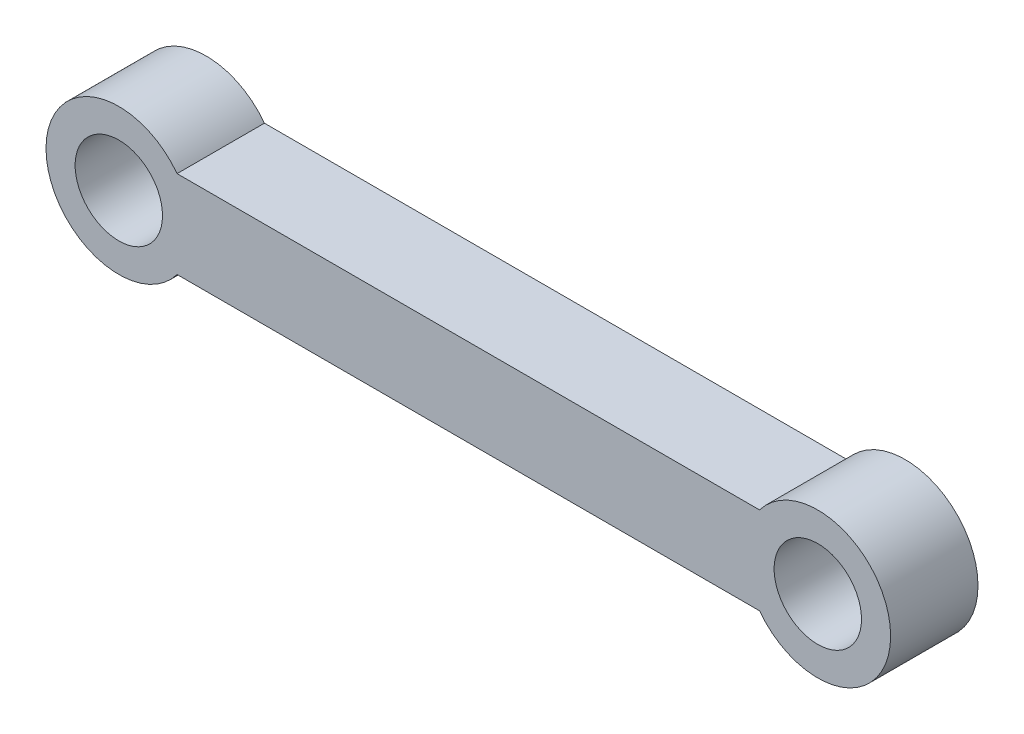
ISO-10303-21;
HEADER;
FILE_DESCRIPTION(('STEP AP214'),'2;1');
FILE_NAME('part.step','',(''),(''),'','','');
FILE_SCHEMA(('AUTOMOTIVE_DESIGN { 1 0 10303 214 1 1 1 1 }'));
ENDSEC;
DATA;
#1=APPLICATION_CONTEXT('core data for automotive mechanical design processes');
#2=APPLICATION_PROTOCOL_DEFINITION('international standard','automotive_design',2000,#1);
#3=PRODUCT_CONTEXT('',#1,'mechanical');
#4=PRODUCT('Part','Part','',(#3));
#5=PRODUCT_RELATED_PRODUCT_CATEGORY('part','',(#4));
#6=PRODUCT_DEFINITION_FORMATION('','',#4);
#7=PRODUCT_DEFINITION_CONTEXT('part definition',#1,'design');
#8=PRODUCT_DEFINITION('design','',#6,#7);
#9=PRODUCT_DEFINITION_SHAPE('','',#8);
#10=(LENGTH_UNIT() NAMED_UNIT(*) SI_UNIT(.MILLI.,.METRE.));
#11=(NAMED_UNIT(*) PLANE_ANGLE_UNIT() SI_UNIT($,.RADIAN.));
#12=(NAMED_UNIT(*) SI_UNIT($,.STERADIAN.) SOLID_ANGLE_UNIT());
#13=UNCERTAINTY_MEASURE_WITH_UNIT(LENGTH_MEASURE(1.E-05),#10,'distance_accuracy_value','');
#14=(GEOMETRIC_REPRESENTATION_CONTEXT(3) GLOBAL_UNCERTAINTY_ASSIGNED_CONTEXT((#13)) GLOBAL_UNIT_ASSIGNED_CONTEXT((#10,
#11,#12)) REPRESENTATION_CONTEXT('',''));
#15=CARTESIAN_POINT('',(0.,0.,0.));
#16=DIRECTION('',(0.,0.,1.));
#17=DIRECTION('',(1.,0.,0.));
#18=AXIS2_PLACEMENT_3D('',#15,#16,#17);
#19=CARTESIAN_POINT('',(-24.,0.,6.));
#20=DIRECTION('',(0.,0.,-1.));
#21=DIRECTION('',(-1.,0.,0.));
#22=AXIS2_PLACEMENT_3D('',#19,#20,#21);
#23=CYLINDRICAL_SURFACE('',#22,5.);
#24=CARTESIAN_POINT('',(-24.,0.,0.));
#25=DIRECTION('',(0.,0.,1.));
#26=DIRECTION('',(1.,0.,0.));
#27=AXIS2_PLACEMENT_3D('',#24,#25,#26);
#28=CIRCLE('',#27,5.);
#29=CARTESIAN_POINT('',(-20.,3.,0.));
#30=VERTEX_POINT('',#29);
#31=CARTESIAN_POINT('',(-20.,-3.,0.));
#32=VERTEX_POINT('',#31);
#33=EDGE_CURVE('E111',#30,#32,#28,.T.);
#34=ORIENTED_EDGE('',*,*,#33,.T.);
#35=DIRECTION('',(0.,0.,-1.));
#36=VECTOR('',#35,1.);
#37=CARTESIAN_POINT('',(-20.,-3.,6.));
#38=LINE('',#37,#36);
#39=CARTESIAN_POINT('',(-20.,-3.,6.));
#40=VERTEX_POINT('',#39);
#41=EDGE_CURVE('E11',#40,#32,#38,.T.);
#42=ORIENTED_EDGE('',*,*,#41,.F.);
#43=CARTESIAN_POINT('',(-24.,0.,6.));
#44=DIRECTION('',(0.,0.,1.));
#45=DIRECTION('',(1.,0.,0.));
#46=AXIS2_PLACEMENT_3D('',#43,#44,#45);
#47=CIRCLE('',#46,5.);
#48=CARTESIAN_POINT('',(-20.,3.,6.));
#49=VERTEX_POINT('',#48);
#50=EDGE_CURVE('E91',#49,#40,#47,.T.);
#51=ORIENTED_EDGE('',*,*,#50,.F.);
#52=DIRECTION('',(0.,0.,-1.));
#53=VECTOR('',#52,1.);
#54=CARTESIAN_POINT('',(-20.,3.,6.));
#55=LINE('',#54,#53);
#56=EDGE_CURVE('E57',#49,#30,#55,.T.);
#57=ORIENTED_EDGE('',*,*,#56,.T.);
#58=EDGE_LOOP('',(#34,#42,#51,#57));
#59=FACE_BOUND('',#58,.T.);
#60=ADVANCED_FACE('F40',(#59),#23,.T.);
#61=CARTESIAN_POINT('',(0.,-3.,6.));
#62=DIRECTION('',(0.,1.,0.));
#63=DIRECTION('',(0.,0.,1.));
#64=AXIS2_PLACEMENT_3D('',#61,#62,#63);
#65=PLANE('',#64);
#66=DIRECTION('',(1.,0.,0.));
#67=VECTOR('',#66,1.);
#68=CARTESIAN_POINT('',(0.,-3.,0.));
#69=LINE('',#68,#67);
#70=CARTESIAN_POINT('',(20.,-3.,0.));
#71=VERTEX_POINT('',#70);
#72=EDGE_CURVE('E96',#32,#71,#69,.T.);
#73=ORIENTED_EDGE('',*,*,#72,.T.);
#74=DIRECTION('',(0.,0.,-1.));
#75=VECTOR('',#74,1.);
#76=CARTESIAN_POINT('',(20.,-3.,6.));
#77=LINE('',#76,#75);
#78=CARTESIAN_POINT('',(20.,-3.,6.));
#79=VERTEX_POINT('',#78);
#80=EDGE_CURVE('E49',#79,#71,#77,.T.);
#81=ORIENTED_EDGE('',*,*,#80,.F.);
#82=DIRECTION('',(1.,0.,0.));
#83=VECTOR('',#82,1.);
#84=CARTESIAN_POINT('',(0.,-3.,6.));
#85=LINE('',#84,#83);
#86=EDGE_CURVE('E83',#40,#79,#85,.T.);
#87=ORIENTED_EDGE('',*,*,#86,.F.);
#88=ORIENTED_EDGE('',*,*,#41,.T.);
#89=EDGE_LOOP('',(#73,#81,#87,#88));
#90=FACE_BOUND('',#89,.T.);
#91=ADVANCED_FACE('F95',(#90),#65,.F.);
#92=CARTESIAN_POINT('',(24.,0.,6.));
#93=DIRECTION('',(0.,0.,-1.));
#94=DIRECTION('',(-1.,0.,0.));
#95=AXIS2_PLACEMENT_3D('',#92,#93,#94);
#96=CYLINDRICAL_SURFACE('',#95,5.);
#97=CARTESIAN_POINT('',(24.,0.,0.));
#98=DIRECTION('',(0.,0.,1.));
#99=DIRECTION('',(1.,0.,0.));
#100=AXIS2_PLACEMENT_3D('',#97,#98,#99);
#101=CIRCLE('',#100,5.);
#102=CARTESIAN_POINT('',(20.,3.,0.));
#103=VERTEX_POINT('',#102);
#104=EDGE_CURVE('E114',#71,#103,#101,.T.);
#105=ORIENTED_EDGE('',*,*,#104,.T.);
#106=DIRECTION('',(0.,0.,-1.));
#107=VECTOR('',#106,1.);
#108=CARTESIAN_POINT('',(20.,3.,6.));
#109=LINE('',#108,#107);
#110=CARTESIAN_POINT('',(20.,3.,6.));
#111=VERTEX_POINT('',#110);
#112=EDGE_CURVE('E72',#111,#103,#109,.T.);
#113=ORIENTED_EDGE('',*,*,#112,.F.);
#114=CARTESIAN_POINT('',(24.,0.,6.));
#115=DIRECTION('',(0.,0.,1.));
#116=DIRECTION('',(1.,0.,0.));
#117=AXIS2_PLACEMENT_3D('',#114,#115,#116);
#118=CIRCLE('',#117,5.);
#119=EDGE_CURVE('E90',#79,#111,#118,.T.);
#120=ORIENTED_EDGE('',*,*,#119,.F.);
#121=ORIENTED_EDGE('',*,*,#80,.T.);
#122=EDGE_LOOP('',(#105,#113,#120,#121));
#123=FACE_BOUND('',#122,.T.);
#124=ADVANCED_FACE('F99',(#123),#96,.T.);
#125=CARTESIAN_POINT('',(0.,3.,6.));
#126=DIRECTION('',(0.,1.,0.));
#127=DIRECTION('',(0.,0.,1.));
#128=AXIS2_PLACEMENT_3D('',#125,#126,#127);
#129=PLANE('',#128);
#130=DIRECTION('',(1.,0.,0.));
#131=VECTOR('',#130,1.);
#132=CARTESIAN_POINT('',(0.,3.,0.));
#133=LINE('',#132,#131);
#134=EDGE_CURVE('E116',#30,#103,#133,.T.);
#135=ORIENTED_EDGE('',*,*,#134,.F.);
#136=ORIENTED_EDGE('',*,*,#56,.F.);
#137=DIRECTION('',(1.,0.,0.));
#138=VECTOR('',#137,1.);
#139=CARTESIAN_POINT('',(0.,3.,6.));
#140=LINE('',#139,#138);
#141=EDGE_CURVE('E100',#49,#111,#140,.T.);
#142=ORIENTED_EDGE('',*,*,#141,.T.);
#143=ORIENTED_EDGE('',*,*,#112,.T.);
#144=EDGE_LOOP('',(#135,#136,#142,#143));
#145=FACE_BOUND('',#144,.T.);
#146=ADVANCED_FACE('F152',(#145),#129,.T.);
#147=CARTESIAN_POINT('',(24.,0.,6.));
#148=DIRECTION('',(0.,0.,-1.));
#149=DIRECTION('',(-1.,0.,0.));
#150=AXIS2_PLACEMENT_3D('',#147,#148,#149);
#151=CYLINDRICAL_SURFACE('',#150,3.);
#152=CARTESIAN_POINT('',(24.,0.,6.));
#153=DIRECTION('',(0.,0.,1.));
#154=DIRECTION('',(1.,0.,0.));
#155=AXIS2_PLACEMENT_3D('',#152,#153,#154);
#156=CIRCLE('',#155,3.);
#157=CARTESIAN_POINT('',(27.,0.,6.));
#158=VERTEX_POINT('',#157);
#159=EDGE_CURVE('E122',#158,#158,#156,.T.);
#160=ORIENTED_EDGE('',*,*,#159,.T.);
#161=EDGE_LOOP('',(#160));
#162=FACE_BOUND('',#161,.T.);
#163=CARTESIAN_POINT('',(24.,0.,0.));
#164=DIRECTION('',(0.,0.,1.));
#165=DIRECTION('',(1.,0.,0.));
#166=AXIS2_PLACEMENT_3D('',#163,#164,#165);
#167=CIRCLE('',#166,3.);
#168=CARTESIAN_POINT('',(27.,0.,0.));
#169=VERTEX_POINT('',#168);
#170=EDGE_CURVE('E108',#169,#169,#167,.T.);
#171=ORIENTED_EDGE('',*,*,#170,.F.);
#172=EDGE_LOOP('',(#171));
#173=FACE_BOUND('',#172,.T.);
#174=ADVANCED_FACE('F42',(#162,#173),#151,.F.);
#175=CARTESIAN_POINT('',(-24.,0.,6.));
#176=DIRECTION('',(0.,0.,-1.));
#177=DIRECTION('',(-1.,0.,0.));
#178=AXIS2_PLACEMENT_3D('',#175,#176,#177);
#179=CYLINDRICAL_SURFACE('',#178,3.);
#180=CARTESIAN_POINT('',(-24.,0.,6.));
#181=DIRECTION('',(0.,0.,1.));
#182=DIRECTION('',(1.,0.,0.));
#183=AXIS2_PLACEMENT_3D('',#180,#181,#182);
#184=CIRCLE('',#183,3.);
#185=CARTESIAN_POINT('',(-21.,0.,6.));
#186=VERTEX_POINT('',#185);
#187=EDGE_CURVE('E102',#186,#186,#184,.T.);
#188=ORIENTED_EDGE('',*,*,#187,.T.);
#189=EDGE_LOOP('',(#188));
#190=FACE_BOUND('',#189,.T.);
#191=CARTESIAN_POINT('',(-24.,0.,0.));
#192=DIRECTION('',(0.,0.,1.));
#193=DIRECTION('',(1.,0.,0.));
#194=AXIS2_PLACEMENT_3D('',#191,#192,#193);
#195=CIRCLE('',#194,3.);
#196=CARTESIAN_POINT('',(-21.,0.,0.));
#197=VERTEX_POINT('',#196);
#198=EDGE_CURVE('E119',#197,#197,#195,.T.);
#199=ORIENTED_EDGE('',*,*,#198,.F.);
#200=EDGE_LOOP('',(#199));
#201=FACE_BOUND('',#200,.T.);
#202=ADVANCED_FACE('F134',(#190,#201),#179,.F.);
#203=CARTESIAN_POINT('',(0.,0.,6.));
#204=DIRECTION('',(0.,0.,1.));
#205=DIRECTION('',(1.,0.,0.));
#206=AXIS2_PLACEMENT_3D('',#203,#204,#205);
#207=PLANE('',#206);
#208=ORIENTED_EDGE('',*,*,#159,.F.);
#209=EDGE_LOOP('',(#208));
#210=FACE_BOUND('',#209,.T.);
#211=ORIENTED_EDGE('',*,*,#50,.T.);
#212=ORIENTED_EDGE('',*,*,#86,.T.);
#213=ORIENTED_EDGE('',*,*,#119,.T.);
#214=ORIENTED_EDGE('',*,*,#141,.F.);
#215=EDGE_LOOP('',(#211,#212,#213,#214));
#216=FACE_BOUND('',#215,.T.);
#217=ORIENTED_EDGE('',*,*,#187,.F.);
#218=EDGE_LOOP('',(#217));
#219=FACE_BOUND('',#218,.T.);
#220=ADVANCED_FACE('F86',(#210,#216,#219),#207,.T.);
#221=CARTESIAN_POINT('',(0.,0.,0.));
#222=DIRECTION('',(0.,0.,1.));
#223=DIRECTION('',(1.,0.,0.));
#224=AXIS2_PLACEMENT_3D('',#221,#222,#223);
#225=PLANE('',#224);
#226=ORIENTED_EDGE('',*,*,#170,.T.);
#227=EDGE_LOOP('',(#226));
#228=FACE_BOUND('',#227,.T.);
#229=ORIENTED_EDGE('',*,*,#33,.F.);
#230=ORIENTED_EDGE('',*,*,#134,.T.);
#231=ORIENTED_EDGE('',*,*,#104,.F.);
#232=ORIENTED_EDGE('',*,*,#72,.F.);
#233=EDGE_LOOP('',(#229,#230,#231,#232));
#234=FACE_BOUND('',#233,.T.);
#235=ORIENTED_EDGE('',*,*,#198,.T.);
#236=EDGE_LOOP('',(#235));
#237=FACE_BOUND('',#236,.T.);
#238=ADVANCED_FACE('F133',(#228,#234,#237),#225,.F.);
#239=CLOSED_SHELL('',(#60,#91,#124,#146,#174,#202,#220,#238));
#240=MANIFOLD_SOLID_BREP('B2',#239);
#241=ADVANCED_BREP_SHAPE_REPRESENTATION('',(#18,#240),#14);
#242=SHAPE_DEFINITION_REPRESENTATION(#9,#241);
ENDSEC;
END-ISO-10303-21;
